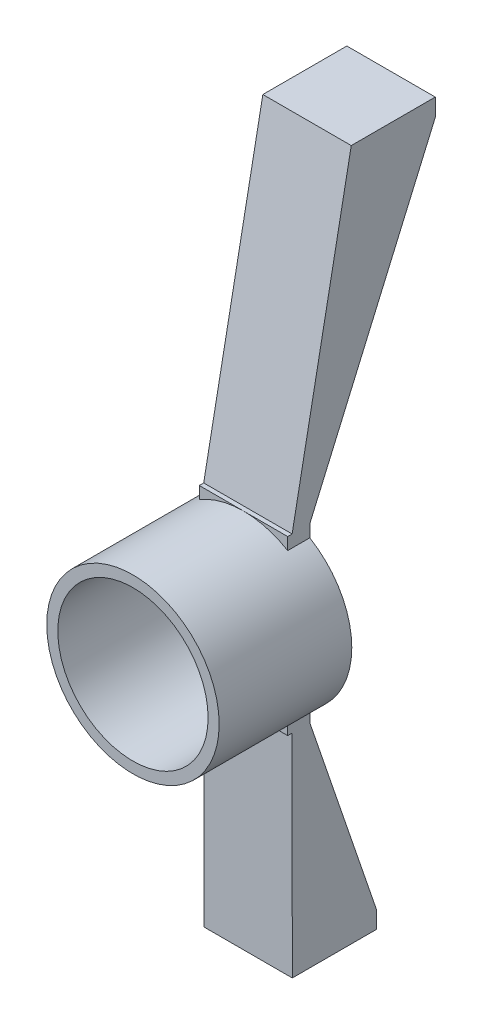
ISO-10303-21;
HEADER;
FILE_DESCRIPTION(('STEP AP214'),'2;1');
FILE_NAME('part.step','',(''),(''),'','','');
FILE_SCHEMA(('AUTOMOTIVE_DESIGN { 1 0 10303 214 1 1 1 1 }'));
ENDSEC;
DATA;
#1=APPLICATION_CONTEXT('core data for automotive mechanical design processes');
#2=APPLICATION_PROTOCOL_DEFINITION('international standard','automotive_design',2000,#1);
#3=PRODUCT_CONTEXT('',#1,'mechanical');
#4=PRODUCT('Part','Part','',(#3));
#5=PRODUCT_RELATED_PRODUCT_CATEGORY('part','',(#4));
#6=PRODUCT_DEFINITION_FORMATION('','',#4);
#7=PRODUCT_DEFINITION_CONTEXT('part definition',#1,'design');
#8=PRODUCT_DEFINITION('design','',#6,#7);
#9=PRODUCT_DEFINITION_SHAPE('','',#8);
#10=(LENGTH_UNIT() NAMED_UNIT(*) SI_UNIT(.MILLI.,.METRE.));
#11=(NAMED_UNIT(*) PLANE_ANGLE_UNIT() SI_UNIT($,.RADIAN.));
#12=(NAMED_UNIT(*) SI_UNIT($,.STERADIAN.) SOLID_ANGLE_UNIT());
#13=UNCERTAINTY_MEASURE_WITH_UNIT(LENGTH_MEASURE(1.E-05),#10,'distance_accuracy_value','');
#14=(GEOMETRIC_REPRESENTATION_CONTEXT(3) GLOBAL_UNCERTAINTY_ASSIGNED_CONTEXT((#13)) GLOBAL_UNIT_ASSIGNED_CONTEXT((#10,
#11,#12)) REPRESENTATION_CONTEXT('',''));
#15=CARTESIAN_POINT('',(0.,0.,0.));
#16=DIRECTION('',(0.,0.,1.));
#17=DIRECTION('',(1.,0.,0.));
#18=AXIS2_PLACEMENT_3D('',#15,#16,#17);
#19=CARTESIAN_POINT('',(20.,-127.,-0.0921534181914807));
#20=DIRECTION('',(0.,-1.,0.));
#21=DIRECTION('',(0.,0.,-1.));
#22=AXIS2_PLACEMENT_3D('',#19,#20,#21);
#23=PLANE('',#22);
#24=DIRECTION('',(0.,0.,1.));
#25=VECTOR('',#24,1.);
#26=CARTESIAN_POINT('',(-12.,-127.,-30.0921534181915));
#27=LINE('',#26,#25);
#28=CARTESIAN_POINT('',(-12.,-127.,-30.0921534181915));
#29=VERTEX_POINT('',#28);
#30=CARTESIAN_POINT('',(-12.,-127.,-0.0921534181914807));
#31=VERTEX_POINT('',#30);
#32=EDGE_CURVE('E96',#29,#31,#27,.T.);
#33=ORIENTED_EDGE('',*,*,#32,.T.);
#34=DIRECTION('',(-1.,0.,0.));
#35=VECTOR('',#34,1.);
#36=CARTESIAN_POINT('',(20.,-127.,-0.0921534181914807));
#37=LINE('',#36,#35);
#38=CARTESIAN_POINT('',(12.,-127.,-0.0921534181914807));
#39=VERTEX_POINT('',#38);
#40=EDGE_CURVE('E329',#39,#31,#37,.T.);
#41=ORIENTED_EDGE('',*,*,#40,.F.);
#42=DIRECTION('',(0.,0.,-1.));
#43=VECTOR('',#42,1.);
#44=CARTESIAN_POINT('',(12.,-127.,-30.0921534181915));
#45=LINE('',#44,#43);
#46=CARTESIAN_POINT('',(12.,-127.,-30.0921534181915));
#47=VERTEX_POINT('',#46);
#48=EDGE_CURVE('E265',#39,#47,#45,.T.);
#49=ORIENTED_EDGE('',*,*,#48,.T.);
#50=DIRECTION('',(-1.,0.,0.));
#51=VECTOR('',#50,1.);
#52=CARTESIAN_POINT('',(20.,-127.,-30.0921534181915));
#53=LINE('',#52,#51);
#54=EDGE_CURVE('E335',#47,#29,#53,.T.);
#55=ORIENTED_EDGE('',*,*,#54,.T.);
#56=EDGE_LOOP('',(#33,#41,#49,#55));
#57=FACE_BOUND('',#56,.T.);
#58=ADVANCED_FACE('F74',(#57),#23,.F.);
#59=CARTESIAN_POINT('',(20.,-39.,0.));
#60=DIRECTION('',(0.,-0.00104719735980363,0.999999451688695));
#61=DIRECTION('',(0.,-0.999999451688695,-0.00104719735980363));
#62=AXIS2_PLACEMENT_3D('',#59,#60,#61);
#63=PLANE('',#62);
#64=DIRECTION('',(0.,0.999999451688695,0.00104719735980363));
#65=VECTOR('',#64,1.);
#66=CARTESIAN_POINT('',(-12.,-127.,-0.0921534181914807));
#67=LINE('',#66,#65);
#68=CARTESIAN_POINT('',(-12.,-39.,0.));
#69=VERTEX_POINT('',#68);
#70=EDGE_CURVE('E261',#31,#69,#67,.T.);
#71=ORIENTED_EDGE('',*,*,#70,.T.);
#72=DIRECTION('',(1.,0.,0.));
#73=VECTOR('',#72,1.);
#74=CARTESIAN_POINT('',(0.,-39.,0.));
#75=LINE('',#74,#73);
#76=CARTESIAN_POINT('',(12.,-39.,0.));
#77=VERTEX_POINT('',#76);
#78=EDGE_CURVE('E239',#69,#77,#75,.T.);
#79=ORIENTED_EDGE('',*,*,#78,.T.);
#80=DIRECTION('',(0.,-0.999999451688695,-0.00104719735980363));
#81=VECTOR('',#80,1.);
#82=CARTESIAN_POINT('',(12.,-127.,-0.0921534181914807));
#83=LINE('',#82,#81);
#84=EDGE_CURVE('E271',#77,#39,#83,.T.);
#85=ORIENTED_EDGE('',*,*,#84,.T.);
#86=ORIENTED_EDGE('',*,*,#40,.T.);
#87=EDGE_LOOP('',(#71,#79,#85,#86));
#88=FACE_BOUND('',#87,.T.);
#89=ADVANCED_FACE('F447',(#88),#63,.F.);
#90=CARTESIAN_POINT('',(0.,0.,60.));
#91=DIRECTION('',(0.,0.,-1.));
#92=DIRECTION('',(-1.,0.,0.));
#93=AXIS2_PLACEMENT_3D('',#90,#91,#92);
#94=CYLINDRICAL_SURFACE('',#93,39.);
#95=CARTESIAN_POINT('',(0.,0.,60.));
#96=DIRECTION('',(0.,0.,1.));
#97=DIRECTION('',(1.,0.,0.));
#98=AXIS2_PLACEMENT_3D('',#95,#96,#97);
#99=CIRCLE('',#98,39.);
#100=CARTESIAN_POINT('',(39.,0.,60.));
#101=VERTEX_POINT('',#100);
#102=EDGE_CURVE('E12',#101,#101,#99,.T.);
#103=ORIENTED_EDGE('',*,*,#102,.F.);
#104=EDGE_LOOP('',(#103));
#105=FACE_BOUND('',#104,.T.);
#106=DIRECTION('',(0.,0.,-1.));
#107=VECTOR('',#106,1.);
#108=CARTESIAN_POINT('',(20.,-33.4813380855664,10.));
#109=LINE('',#108,#107);
#110=CARTESIAN_POINT('',(20.,-33.4813380855664,10.));
#111=VERTEX_POINT('',#110);
#112=CARTESIAN_POINT('',(20.,-33.4813380855664,0.));
#113=VERTEX_POINT('',#112);
#114=EDGE_CURVE('E306',#111,#113,#109,.T.);
#115=ORIENTED_EDGE('',*,*,#114,.T.);
#116=CARTESIAN_POINT('',(0.,0.,0.));
#117=DIRECTION('',(0.,0.,1.));
#118=DIRECTION('',(1.,0.,0.));
#119=AXIS2_PLACEMENT_3D('',#116,#117,#118);
#120=CIRCLE('',#119,39.);
#121=CARTESIAN_POINT('',(20.,33.4813380855664,0.));
#122=VERTEX_POINT('',#121);
#123=EDGE_CURVE('E427',#113,#122,#120,.T.);
#124=ORIENTED_EDGE('',*,*,#123,.T.);
#125=DIRECTION('',(0.,0.,-1.));
#126=VECTOR('',#125,1.);
#127=CARTESIAN_POINT('',(20.,33.4813380855664,10.));
#128=LINE('',#127,#126);
#129=CARTESIAN_POINT('',(20.,33.4813380855664,10.));
#130=VERTEX_POINT('',#129);
#131=EDGE_CURVE('E419',#130,#122,#128,.T.);
#132=ORIENTED_EDGE('',*,*,#131,.F.);
#133=CARTESIAN_POINT('',(0.,0.,10.));
#134=DIRECTION('',(0.,0.,-1.));
#135=DIRECTION('',(-1.,0.,0.));
#136=AXIS2_PLACEMENT_3D('',#133,#134,#135);
#137=CIRCLE('',#136,39.);
#138=CARTESIAN_POINT('',(0.,39.,10.));
#139=VERTEX_POINT('',#138);
#140=EDGE_CURVE('E411',#139,#130,#137,.T.);
#141=ORIENTED_EDGE('',*,*,#140,.F.);
#142=CARTESIAN_POINT('',(0.,0.,10.));
#143=DIRECTION('',(0.,0.,-1.));
#144=DIRECTION('',(-1.,0.,0.));
#145=AXIS2_PLACEMENT_3D('',#142,#143,#144);
#146=CIRCLE('',#145,39.);
#147=CARTESIAN_POINT('',(-20.,33.4813380855664,10.));
#148=VERTEX_POINT('',#147);
#149=EDGE_CURVE('E361',#148,#139,#146,.T.);
#150=ORIENTED_EDGE('',*,*,#149,.F.);
#151=DIRECTION('',(0.,0.,-1.));
#152=VECTOR('',#151,1.);
#153=CARTESIAN_POINT('',(-20.,33.4813380855664,10.));
#154=LINE('',#153,#152);
#155=CARTESIAN_POINT('',(-20.,33.4813380855664,0.));
#156=VERTEX_POINT('',#155);
#157=EDGE_CURVE('E367',#148,#156,#154,.T.);
#158=ORIENTED_EDGE('',*,*,#157,.T.);
#159=CARTESIAN_POINT('',(-20.,-33.4813380855664,0.));
#160=VERTEX_POINT('',#159);
#161=EDGE_CURVE('E78',#156,#160,#120,.T.);
#162=ORIENTED_EDGE('',*,*,#161,.T.);
#163=DIRECTION('',(0.,0.,-1.));
#164=VECTOR('',#163,1.);
#165=CARTESIAN_POINT('',(-20.,-33.4813380855664,10.));
#166=LINE('',#165,#164);
#167=CARTESIAN_POINT('',(-20.,-33.4813380855664,10.));
#168=VERTEX_POINT('',#167);
#169=EDGE_CURVE('E252',#168,#160,#166,.T.);
#170=ORIENTED_EDGE('',*,*,#169,.F.);
#171=CARTESIAN_POINT('',(0.,0.,10.));
#172=DIRECTION('',(0.,0.,-1.));
#173=DIRECTION('',(-1.,0.,0.));
#174=AXIS2_PLACEMENT_3D('',#171,#172,#173);
#175=CIRCLE('',#174,39.);
#176=CARTESIAN_POINT('',(0.,-39.,10.));
#177=VERTEX_POINT('',#176);
#178=EDGE_CURVE('E350',#177,#168,#175,.T.);
#179=ORIENTED_EDGE('',*,*,#178,.F.);
#180=CARTESIAN_POINT('',(0.,0.,10.));
#181=DIRECTION('',(0.,0.,-1.));
#182=DIRECTION('',(-1.,0.,0.));
#183=AXIS2_PLACEMENT_3D('',#180,#181,#182);
#184=CIRCLE('',#183,39.);
#185=EDGE_CURVE('E316',#111,#177,#184,.T.);
#186=ORIENTED_EDGE('',*,*,#185,.F.);
#187=EDGE_LOOP('',(#115,#124,#132,#141,#150,#158,#162,#170,#179,#186));
#188=FACE_BOUND('',#187,.T.);
#189=ADVANCED_FACE('F76',(#105,#188),#94,.T.);
#190=CARTESIAN_POINT('',(0.,-39.,10.));
#191=DIRECTION('',(0.,1.,0.));
#192=DIRECTION('',(0.,0.,1.));
#193=AXIS2_PLACEMENT_3D('',#190,#191,#192);
#194=PLANE('',#193);
#195=DIRECTION('',(0.,0.,-1.));
#196=VECTOR('',#195,1.);
#197=CARTESIAN_POINT('',(-20.,-39.,10.));
#198=LINE('',#197,#196);
#199=CARTESIAN_POINT('',(-20.,-39.,10.));
#200=VERTEX_POINT('',#199);
#201=CARTESIAN_POINT('',(-20.,-39.,8.));
#202=VERTEX_POINT('',#201);
#203=EDGE_CURVE('E352',#200,#202,#198,.T.);
#204=ORIENTED_EDGE('',*,*,#203,.T.);
#205=DIRECTION('',(-1.,0.,0.));
#206=VECTOR('',#205,1.);
#207=CARTESIAN_POINT('',(20.,-39.,8.));
#208=LINE('',#207,#206);
#209=CARTESIAN_POINT('',(20.,-39.,8.));
#210=VERTEX_POINT('',#209);
#211=EDGE_CURVE('E344',#210,#202,#208,.T.);
#212=ORIENTED_EDGE('',*,*,#211,.F.);
#213=DIRECTION('',(0.,0.,-1.));
#214=VECTOR('',#213,1.);
#215=CARTESIAN_POINT('',(20.,-39.,10.));
#216=LINE('',#215,#214);
#217=CARTESIAN_POINT('',(20.,-39.,10.));
#218=VERTEX_POINT('',#217);
#219=EDGE_CURVE('E303',#218,#210,#216,.T.);
#220=ORIENTED_EDGE('',*,*,#219,.F.);
#221=DIRECTION('',(1.,0.,0.));
#222=VECTOR('',#221,1.);
#223=CARTESIAN_POINT('',(0.,-39.,10.));
#224=LINE('',#223,#222);
#225=EDGE_CURVE('E314',#177,#218,#224,.T.);
#226=ORIENTED_EDGE('',*,*,#225,.F.);
#227=DIRECTION('',(1.,0.,0.));
#228=VECTOR('',#227,1.);
#229=CARTESIAN_POINT('',(0.,-39.,10.));
#230=LINE('',#229,#228);
#231=EDGE_CURVE('E253',#200,#177,#230,.T.);
#232=ORIENTED_EDGE('',*,*,#231,.F.);
#233=EDGE_LOOP('',(#204,#212,#220,#226,#232));
#234=FACE_BOUND('',#233,.T.);
#235=ADVANCED_FACE('F475',(#234),#194,.F.);
#236=CARTESIAN_POINT('',(0.,39.,10.));
#237=DIRECTION('',(0.,-1.,0.));
#238=DIRECTION('',(0.,0.,-1.));
#239=AXIS2_PLACEMENT_3D('',#236,#237,#238);
#240=PLANE('',#239);
#241=DIRECTION('',(-1.,0.,0.));
#242=VECTOR('',#241,1.);
#243=CARTESIAN_POINT('',(20.,39.,8.));
#244=LINE('',#243,#242);
#245=CARTESIAN_POINT('',(20.,39.,8.));
#246=VERTEX_POINT('',#245);
#247=CARTESIAN_POINT('',(-20.,39.,8.));
#248=VERTEX_POINT('',#247);
#249=EDGE_CURVE('E383',#246,#248,#244,.T.);
#250=ORIENTED_EDGE('',*,*,#249,.T.);
#251=DIRECTION('',(0.,0.,-1.));
#252=VECTOR('',#251,1.);
#253=CARTESIAN_POINT('',(-20.,39.,10.));
#254=LINE('',#253,#252);
#255=CARTESIAN_POINT('',(-20.,39.,10.));
#256=VERTEX_POINT('',#255);
#257=EDGE_CURVE('E370',#256,#248,#254,.T.);
#258=ORIENTED_EDGE('',*,*,#257,.F.);
#259=DIRECTION('',(-1.,0.,0.));
#260=VECTOR('',#259,1.);
#261=CARTESIAN_POINT('',(0.,39.,10.));
#262=LINE('',#261,#260);
#263=EDGE_CURVE('E358',#139,#256,#262,.T.);
#264=ORIENTED_EDGE('',*,*,#263,.F.);
#265=DIRECTION('',(-1.,0.,0.));
#266=VECTOR('',#265,1.);
#267=CARTESIAN_POINT('',(0.,39.,10.));
#268=LINE('',#267,#266);
#269=CARTESIAN_POINT('',(20.,39.,10.));
#270=VERTEX_POINT('',#269);
#271=EDGE_CURVE('E404',#270,#139,#268,.T.);
#272=ORIENTED_EDGE('',*,*,#271,.F.);
#273=DIRECTION('',(0.,0.,-1.));
#274=VECTOR('',#273,1.);
#275=CARTESIAN_POINT('',(20.,39.,10.));
#276=LINE('',#275,#274);
#277=EDGE_CURVE('E414',#270,#246,#276,.T.);
#278=ORIENTED_EDGE('',*,*,#277,.T.);
#279=EDGE_LOOP('',(#250,#258,#264,#272,#278));
#280=FACE_BOUND('',#279,.T.);
#281=ADVANCED_FACE('F478',(#280),#240,.F.);
#282=CARTESIAN_POINT('',(0.,0.,60.));
#283=DIRECTION('',(0.,0.,1.));
#284=DIRECTION('',(1.,0.,0.));
#285=AXIS2_PLACEMENT_3D('',#282,#283,#284);
#286=PLANE('',#285);
#287=ORIENTED_EDGE('',*,*,#102,.T.);
#288=EDGE_LOOP('',(#287));
#289=FACE_BOUND('',#288,.T.);
#290=CARTESIAN_POINT('',(0.,0.,60.));
#291=DIRECTION('',(0.,0.,1.));
#292=DIRECTION('',(1.,0.,0.));
#293=AXIS2_PLACEMENT_3D('',#290,#291,#292);
#294=CIRCLE('',#293,34.);
#295=CARTESIAN_POINT('',(34.,0.,60.));
#296=VERTEX_POINT('',#295);
#297=EDGE_CURVE('E424',#296,#296,#294,.T.);
#298=ORIENTED_EDGE('',*,*,#297,.F.);
#299=EDGE_LOOP('',(#298));
#300=FACE_BOUND('',#299,.T.);
#301=ADVANCED_FACE('F443',(#289,#300),#286,.T.);
#302=CARTESIAN_POINT('',(0.,0.,0.));
#303=DIRECTION('',(0.,0.,1.));
#304=DIRECTION('',(1.,0.,0.));
#305=AXIS2_PLACEMENT_3D('',#302,#303,#304);
#306=PLANE('',#305);
#307=ORIENTED_EDGE('',*,*,#161,.F.);
#308=DIRECTION('',(0.,-1.,0.));
#309=VECTOR('',#308,1.);
#310=CARTESIAN_POINT('',(-20.,0.,0.));
#311=LINE('',#310,#309);
#312=CARTESIAN_POINT('',(-20.,39.,0.));
#313=VERTEX_POINT('',#312);
#314=EDGE_CURVE('E355',#313,#156,#311,.T.);
#315=ORIENTED_EDGE('',*,*,#314,.F.);
#316=DIRECTION('',(-1.,0.,0.));
#317=VECTOR('',#316,1.);
#318=CARTESIAN_POINT('',(-12.,39.,0.));
#319=LINE('',#318,#317);
#320=CARTESIAN_POINT('',(-12.,39.,0.));
#321=VERTEX_POINT('',#320);
#322=EDGE_CURVE('E286',#321,#313,#319,.T.);
#323=ORIENTED_EDGE('',*,*,#322,.F.);
#324=DIRECTION('',(-1.,0.,0.));
#325=VECTOR('',#324,1.);
#326=CARTESIAN_POINT('',(0.,39.,0.));
#327=LINE('',#326,#325);
#328=CARTESIAN_POINT('',(12.,39.,0.));
#329=VERTEX_POINT('',#328);
#330=EDGE_CURVE('E403',#329,#321,#327,.T.);
#331=ORIENTED_EDGE('',*,*,#330,.F.);
#332=CARTESIAN_POINT('',(20.,39.,0.));
#333=VERTEX_POINT('',#332);
#334=EDGE_CURVE('E415',#333,#329,#327,.T.);
#335=ORIENTED_EDGE('',*,*,#334,.F.);
#336=DIRECTION('',(0.,-1.,0.));
#337=VECTOR('',#336,1.);
#338=CARTESIAN_POINT('',(20.,0.,0.));
#339=LINE('',#338,#337);
#340=EDGE_CURVE('E408',#333,#122,#339,.T.);
#341=ORIENTED_EDGE('',*,*,#340,.T.);
#342=ORIENTED_EDGE('',*,*,#123,.F.);
#343=DIRECTION('',(0.,1.,0.));
#344=VECTOR('',#343,1.);
#345=CARTESIAN_POINT('',(20.,0.,0.));
#346=LINE('',#345,#344);
#347=CARTESIAN_POINT('',(20.,-39.,0.));
#348=VERTEX_POINT('',#347);
#349=EDGE_CURVE('E311',#348,#113,#346,.T.);
#350=ORIENTED_EDGE('',*,*,#349,.F.);
#351=DIRECTION('',(1.,0.,0.));
#352=VECTOR('',#351,1.);
#353=CARTESIAN_POINT('',(12.,-39.,0.));
#354=LINE('',#353,#352);
#355=EDGE_CURVE('E274',#77,#348,#354,.T.);
#356=ORIENTED_EDGE('',*,*,#355,.F.);
#357=ORIENTED_EDGE('',*,*,#78,.F.);
#358=CARTESIAN_POINT('',(-20.,-39.,0.));
#359=VERTEX_POINT('',#358);
#360=EDGE_CURVE('E232',#359,#69,#75,.T.);
#361=ORIENTED_EDGE('',*,*,#360,.F.);
#362=DIRECTION('',(0.,1.,0.));
#363=VECTOR('',#362,1.);
#364=CARTESIAN_POINT('',(-20.,0.,0.));
#365=LINE('',#364,#363);
#366=EDGE_CURVE('E237',#359,#160,#365,.T.);
#367=ORIENTED_EDGE('',*,*,#366,.T.);
#368=EDGE_LOOP('',(#307,#315,#323,#331,#335,#341,#342,#350,#356,#357,#361,#367));
#369=FACE_BOUND('',#368,.T.);
#370=CARTESIAN_POINT('',(0.,0.,0.));
#371=DIRECTION('',(0.,0.,1.));
#372=DIRECTION('',(1.,0.,0.));
#373=AXIS2_PLACEMENT_3D('',#370,#371,#372);
#374=CIRCLE('',#373,34.);
#375=CARTESIAN_POINT('',(34.,0.,0.));
#376=VERTEX_POINT('',#375);
#377=EDGE_CURVE('E422',#376,#376,#374,.T.);
#378=ORIENTED_EDGE('',*,*,#377,.T.);
#379=EDGE_LOOP('',(#378));
#380=FACE_BOUND('',#379,.T.);
#381=ADVANCED_FACE('F235',(#369,#380),#306,.F.);
#382=CARTESIAN_POINT('',(0.,0.,60.));
#383=DIRECTION('',(0.,0.,-1.));
#384=DIRECTION('',(-1.,0.,0.));
#385=AXIS2_PLACEMENT_3D('',#382,#383,#384);
#386=CYLINDRICAL_SURFACE('',#385,34.);
#387=ORIENTED_EDGE('',*,*,#297,.T.);
#388=EDGE_LOOP('',(#387));
#389=FACE_BOUND('',#388,.T.);
#390=ORIENTED_EDGE('',*,*,#377,.F.);
#391=EDGE_LOOP('',(#390));
#392=FACE_BOUND('',#391,.T.);
#393=ADVANCED_FACE('F431',(#389,#392),#386,.F.);
#394=CARTESIAN_POINT('',(20.,0.,10.));
#395=DIRECTION('',(1.,0.,0.));
#396=DIRECTION('',(0.,0.,-1.));
#397=AXIS2_PLACEMENT_3D('',#394,#395,#396);
#398=PLANE('',#397);
#399=ORIENTED_EDGE('',*,*,#340,.F.);
#400=DIRECTION('',(0.,0.917366710580717,-0.398043111130333));
#401=VECTOR('',#400,1.);
#402=CARTESIAN_POINT('',(20.,169.8,-56.7537914068078));
#403=LINE('',#402,#401);
#404=CARTESIAN_POINT('',(20.,169.8,-56.7537914068078));
#405=VERTEX_POINT('',#404);
#406=EDGE_CURVE('E291',#333,#405,#403,.T.);
#407=ORIENTED_EDGE('',*,*,#406,.T.);
#408=DIRECTION('',(0.,1.,0.));
#409=VECTOR('',#408,1.);
#410=CARTESIAN_POINT('',(20.,169.8,-56.7537914068078));
#411=LINE('',#410,#409);
#412=CARTESIAN_POINT('',(20.,177.8,-56.7537914068078));
#413=VERTEX_POINT('',#412);
#414=EDGE_CURVE('E375',#405,#413,#411,.T.);
#415=ORIENTED_EDGE('',*,*,#414,.T.);
#416=DIRECTION('',(0.,0.,1.));
#417=VECTOR('',#416,1.);
#418=CARTESIAN_POINT('',(20.,177.8,-18.7537914068078));
#419=LINE('',#418,#417);
#420=CARTESIAN_POINT('',(20.,177.8,-18.7537914068078));
#421=VERTEX_POINT('',#420);
#422=EDGE_CURVE('E377',#413,#421,#419,.T.);
#423=ORIENTED_EDGE('',*,*,#422,.T.);
#424=DIRECTION('',(0.,-0.981925694359719,0.189266824235482));
#425=VECTOR('',#424,1.);
#426=CARTESIAN_POINT('',(20.,39.,8.));
#427=LINE('',#426,#425);
#428=EDGE_CURVE('E380',#421,#246,#427,.T.);
#429=ORIENTED_EDGE('',*,*,#428,.T.);
#430=ORIENTED_EDGE('',*,*,#277,.F.);
#431=DIRECTION('',(0.,-1.,0.));
#432=VECTOR('',#431,1.);
#433=CARTESIAN_POINT('',(20.,0.,10.));
#434=LINE('',#433,#432);
#435=EDGE_CURVE('E407',#270,#130,#434,.T.);
#436=ORIENTED_EDGE('',*,*,#435,.T.);
#437=ORIENTED_EDGE('',*,*,#131,.T.);
#438=EDGE_LOOP('',(#399,#407,#415,#423,#429,#430,#436,#437));
#439=FACE_BOUND('',#438,.T.);
#440=ADVANCED_FACE('F433',(#439),#398,.T.);
#441=CARTESIAN_POINT('',(0.,0.,10.));
#442=DIRECTION('',(0.,0.,-1.));
#443=DIRECTION('',(-1.,0.,0.));
#444=AXIS2_PLACEMENT_3D('',#441,#442,#443);
#445=PLANE('',#444);
#446=ORIENTED_EDGE('',*,*,#271,.T.);
#447=ORIENTED_EDGE('',*,*,#140,.T.);
#448=ORIENTED_EDGE('',*,*,#435,.F.);
#449=EDGE_LOOP('',(#446,#447,#448));
#450=FACE_BOUND('',#449,.T.);
#451=ADVANCED_FACE('F440',(#450),#445,.F.);
#452=CARTESIAN_POINT('',(20.,39.,0.));
#453=DIRECTION('',(0.,0.189266824235482,0.981925694359718));
#454=DIRECTION('',(0.,-0.981925694359718,0.189266824235482));
#455=AXIS2_PLACEMENT_3D('',#452,#453,#454);
#456=PLANE('',#455);
#457=ORIENTED_EDGE('',*,*,#330,.T.);
#458=DIRECTION('',(0.,0.981925694359718,-0.189266824235482));
#459=VECTOR('',#458,1.);
#460=CARTESIAN_POINT('',(-12.,39.,0.));
#461=LINE('',#460,#459);
#462=CARTESIAN_POINT('',(-12.,169.8,-25.2117861384039));
#463=VERTEX_POINT('',#462);
#464=EDGE_CURVE('E282',#321,#463,#461,.T.);
#465=ORIENTED_EDGE('',*,*,#464,.T.);
#466=DIRECTION('',(-1.,0.,0.));
#467=VECTOR('',#466,1.);
#468=CARTESIAN_POINT('',(20.,169.8,-25.2117861384039));
#469=LINE('',#468,#467);
#470=CARTESIAN_POINT('',(12.,169.8,-25.2117861384039));
#471=VERTEX_POINT('',#470);
#472=EDGE_CURVE('E400',#471,#463,#469,.T.);
#473=ORIENTED_EDGE('',*,*,#472,.F.);
#474=DIRECTION('',(0.,-0.981925694359718,0.189266824235482));
#475=VECTOR('',#474,1.);
#476=CARTESIAN_POINT('',(12.,39.,0.));
#477=LINE('',#476,#475);
#478=EDGE_CURVE('E294',#471,#329,#477,.T.);
#479=ORIENTED_EDGE('',*,*,#478,.T.);
#480=EDGE_LOOP('',(#457,#465,#473,#479));
#481=FACE_BOUND('',#480,.T.);
#482=ADVANCED_FACE('F502',(#481),#456,.F.);
#483=CARTESIAN_POINT('',(20.,169.8,-25.2117861384039));
#484=DIRECTION('',(0.,1.,0.));
#485=DIRECTION('',(0.,0.,1.));
#486=AXIS2_PLACEMENT_3D('',#483,#484,#485);
#487=PLANE('',#486);
#488=ORIENTED_EDGE('',*,*,#472,.T.);
#489=DIRECTION('',(0.,0.,-1.));
#490=VECTOR('',#489,1.);
#491=CARTESIAN_POINT('',(-12.,169.8,-25.2117861384039));
#492=LINE('',#491,#490);
#493=CARTESIAN_POINT('',(-12.,169.8,-56.7537914068078));
#494=VERTEX_POINT('',#493);
#495=EDGE_CURVE('E284',#463,#494,#492,.T.);
#496=ORIENTED_EDGE('',*,*,#495,.T.);
#497=DIRECTION('',(-1.,0.,0.));
#498=VECTOR('',#497,1.);
#499=CARTESIAN_POINT('',(20.,169.8,-56.7537914068078));
#500=LINE('',#499,#498);
#501=CARTESIAN_POINT('',(12.,169.8,-56.7537914068078));
#502=VERTEX_POINT('',#501);
#503=EDGE_CURVE('E396',#502,#494,#500,.T.);
#504=ORIENTED_EDGE('',*,*,#503,.F.);
#505=DIRECTION('',(0.,0.,1.));
#506=VECTOR('',#505,1.);
#507=CARTESIAN_POINT('',(12.,169.8,-25.2117861384039));
#508=LINE('',#507,#506);
#509=EDGE_CURVE('E300',#502,#471,#508,.T.);
#510=ORIENTED_EDGE('',*,*,#509,.T.);
#511=EDGE_LOOP('',(#488,#496,#504,#510));
#512=FACE_BOUND('',#511,.T.);
#513=ADVANCED_FACE('F498',(#512),#487,.F.);
#514=CARTESIAN_POINT('',(20.,169.8,-56.7537914068078));
#515=DIRECTION('',(0.,0.,1.));
#516=DIRECTION('',(1.,0.,0.));
#517=AXIS2_PLACEMENT_3D('',#514,#515,#516);
#518=PLANE('',#517);
#519=DIRECTION('',(0.,1.,0.));
#520=VECTOR('',#519,1.);
#521=CARTESIAN_POINT('',(-20.,169.8,-56.7537914068078));
#522=LINE('',#521,#520);
#523=CARTESIAN_POINT('',(-20.,169.8,-56.7537914068078));
#524=VERTEX_POINT('',#523);
#525=CARTESIAN_POINT('',(-20.,177.8,-56.7537914068078));
#526=VERTEX_POINT('',#525);
#527=EDGE_CURVE('E373',#524,#526,#522,.T.);
#528=ORIENTED_EDGE('',*,*,#527,.T.);
#529=DIRECTION('',(-1.,0.,0.));
#530=VECTOR('',#529,1.);
#531=CARTESIAN_POINT('',(20.,177.8,-56.7537914068078));
#532=LINE('',#531,#530);
#533=EDGE_CURVE('E393',#413,#526,#532,.T.);
#534=ORIENTED_EDGE('',*,*,#533,.F.);
#535=ORIENTED_EDGE('',*,*,#414,.F.);
#536=EDGE_CURVE('E397',#405,#502,#500,.T.);
#537=ORIENTED_EDGE('',*,*,#536,.T.);
#538=ORIENTED_EDGE('',*,*,#503,.T.);
#539=DIRECTION('',(-1.,0.,0.));
#540=VECTOR('',#539,1.);
#541=CARTESIAN_POINT('',(-12.,169.8,-56.7537914068078));
#542=LINE('',#541,#540);
#543=EDGE_CURVE('E289',#494,#524,#542,.T.);
#544=ORIENTED_EDGE('',*,*,#543,.T.);
#545=EDGE_LOOP('',(#528,#534,#535,#537,#538,#544));
#546=FACE_BOUND('',#545,.T.);
#547=ADVANCED_FACE('F494',(#546),#518,.F.);
#548=CARTESIAN_POINT('',(20.,177.8,-18.7537914068078));
#549=DIRECTION('',(0.,-1.,0.));
#550=DIRECTION('',(0.,0.,-1.));
#551=AXIS2_PLACEMENT_3D('',#548,#549,#550);
#552=PLANE('',#551);
#553=DIRECTION('',(0.,0.,1.));
#554=VECTOR('',#553,1.);
#555=CARTESIAN_POINT('',(-20.,177.8,-18.7537914068078));
#556=LINE('',#555,#554);
#557=CARTESIAN_POINT('',(-20.,177.8,-18.7537914068078));
#558=VERTEX_POINT('',#557);
#559=EDGE_CURVE('E385',#526,#558,#556,.T.);
#560=ORIENTED_EDGE('',*,*,#559,.T.);
#561=DIRECTION('',(-1.,0.,0.));
#562=VECTOR('',#561,1.);
#563=CARTESIAN_POINT('',(20.,177.8,-18.7537914068078));
#564=LINE('',#563,#562);
#565=EDGE_CURVE('E390',#421,#558,#564,.T.);
#566=ORIENTED_EDGE('',*,*,#565,.F.);
#567=ORIENTED_EDGE('',*,*,#422,.F.);
#568=ORIENTED_EDGE('',*,*,#533,.T.);
#569=EDGE_LOOP('',(#560,#566,#567,#568));
#570=FACE_BOUND('',#569,.T.);
#571=ADVANCED_FACE('F490',(#570),#552,.F.);
#572=CARTESIAN_POINT('',(20.,39.,8.));
#573=DIRECTION('',(0.,-0.189266824235482,-0.981925694359719));
#574=DIRECTION('',(0.,0.981925694359719,-0.189266824235482));
#575=AXIS2_PLACEMENT_3D('',#572,#573,#574);
#576=PLANE('',#575);
#577=DIRECTION('',(0.,-0.981925694359719,0.189266824235482));
#578=VECTOR('',#577,1.);
#579=CARTESIAN_POINT('',(-20.,39.,8.));
#580=LINE('',#579,#578);
#581=EDGE_CURVE('E378',#558,#248,#580,.T.);
#582=ORIENTED_EDGE('',*,*,#581,.T.);
#583=ORIENTED_EDGE('',*,*,#249,.F.);
#584=ORIENTED_EDGE('',*,*,#428,.F.);
#585=ORIENTED_EDGE('',*,*,#565,.T.);
#586=EDGE_LOOP('',(#582,#583,#584,#585));
#587=FACE_BOUND('',#586,.T.);
#588=ADVANCED_FACE('F486',(#587),#576,.F.);
#589=CARTESIAN_POINT('',(-20.,0.,0.));
#590=DIRECTION('',(-1.,0.,0.));
#591=DIRECTION('',(0.,0.,1.));
#592=AXIS2_PLACEMENT_3D('',#589,#590,#591);
#593=PLANE('',#592);
#594=ORIENTED_EDGE('',*,*,#527,.F.);
#595=DIRECTION('',(0.,-0.917366710580717,0.398043111130333));
#596=VECTOR('',#595,1.);
#597=CARTESIAN_POINT('',(-20.,169.8,-56.7537914068078));
#598=LINE('',#597,#596);
#599=EDGE_CURVE('E278',#524,#313,#598,.T.);
#600=ORIENTED_EDGE('',*,*,#599,.T.);
#601=ORIENTED_EDGE('',*,*,#314,.T.);
#602=ORIENTED_EDGE('',*,*,#157,.F.);
#603=DIRECTION('',(0.,-1.,0.));
#604=VECTOR('',#603,1.);
#605=CARTESIAN_POINT('',(-20.,0.,10.));
#606=LINE('',#605,#604);
#607=EDGE_CURVE('E364',#256,#148,#606,.T.);
#608=ORIENTED_EDGE('',*,*,#607,.F.);
#609=ORIENTED_EDGE('',*,*,#257,.T.);
#610=ORIENTED_EDGE('',*,*,#581,.F.);
#611=ORIENTED_EDGE('',*,*,#559,.F.);
#612=EDGE_LOOP('',(#594,#600,#601,#602,#608,#609,#610,#611));
#613=FACE_BOUND('',#612,.T.);
#614=ADVANCED_FACE('F482',(#613),#593,.T.);
#615=CARTESIAN_POINT('',(0.,0.,10.));
#616=DIRECTION('',(0.,0.,-1.));
#617=DIRECTION('',(-1.,0.,0.));
#618=AXIS2_PLACEMENT_3D('',#615,#616,#617);
#619=PLANE('',#618);
#620=ORIENTED_EDGE('',*,*,#263,.T.);
#621=ORIENTED_EDGE('',*,*,#607,.T.);
#622=ORIENTED_EDGE('',*,*,#149,.T.);
#623=EDGE_LOOP('',(#620,#621,#622));
#624=FACE_BOUND('',#623,.T.);
#625=ADVANCED_FACE('F472',(#624),#619,.F.);
#626=CARTESIAN_POINT('',(-20.,0.,10.));
#627=DIRECTION('',(-1.,0.,0.));
#628=DIRECTION('',(0.,0.,1.));
#629=AXIS2_PLACEMENT_3D('',#626,#627,#628);
#630=PLANE('',#629);
#631=ORIENTED_EDGE('',*,*,#366,.F.);
#632=DIRECTION('',(0.,-0.946207147348666,-0.323561484584152));
#633=VECTOR('',#632,1.);
#634=CARTESIAN_POINT('',(-20.,-39.,0.));
#635=LINE('',#634,#633);
#636=CARTESIAN_POINT('',(-20.,-127.,-30.0921534181915));
#637=VERTEX_POINT('',#636);
#638=EDGE_CURVE('E250',#359,#637,#635,.T.);
#639=ORIENTED_EDGE('',*,*,#638,.T.);
#640=DIRECTION('',(0.,0.999999451678283,-0.00104720730182724));
#641=VECTOR('',#640,1.);
#642=CARTESIAN_POINT('',(-20.,-127.,-30.0921534181915));
#643=LINE('',#642,#641);
#644=CARTESIAN_POINT('',(-20.,-134.999963445912,-30.0837757934629));
#645=VERTEX_POINT('',#644);
#646=EDGE_CURVE('E324',#645,#637,#643,.T.);
#647=ORIENTED_EDGE('',*,*,#646,.F.);
#648=DIRECTION('',(0.,0.,-1.));
#649=VECTOR('',#648,1.);
#650=CARTESIAN_POINT('',(-20.,-134.999963445912,7.91622420653706));
#651=LINE('',#650,#649);
#652=CARTESIAN_POINT('',(-20.,-134.999963445912,7.91622420653706));
#653=VERTEX_POINT('',#652);
#654=EDGE_CURVE('E331',#653,#645,#651,.T.);
#655=ORIENTED_EDGE('',*,*,#654,.F.);
#656=DIRECTION('',(0.,-0.99999961922825,-0.000872664515238929));
#657=VECTOR('',#656,1.);
#658=CARTESIAN_POINT('',(-20.,-39.,8.));
#659=LINE('',#658,#657);
#660=EDGE_CURVE('E313',#202,#653,#659,.T.);
#661=ORIENTED_EDGE('',*,*,#660,.F.);
#662=ORIENTED_EDGE('',*,*,#203,.F.);
#663=DIRECTION('',(0.,1.,0.));
#664=VECTOR('',#663,1.);
#665=CARTESIAN_POINT('',(-20.,0.,10.));
#666=LINE('',#665,#664);
#667=EDGE_CURVE('E348',#200,#168,#666,.T.);
#668=ORIENTED_EDGE('',*,*,#667,.T.);
#669=ORIENTED_EDGE('',*,*,#169,.T.);
#670=EDGE_LOOP('',(#631,#639,#647,#655,#661,#662,#668,#669));
#671=FACE_BOUND('',#670,.T.);
#672=ADVANCED_FACE('F248',(#671),#630,.T.);
#673=CARTESIAN_POINT('',(0.,0.,10.));
#674=DIRECTION('',(0.,0.,-1.));
#675=DIRECTION('',(-1.,0.,0.));
#676=AXIS2_PLACEMENT_3D('',#673,#674,#675);
#677=PLANE('',#676);
#678=ORIENTED_EDGE('',*,*,#231,.T.);
#679=ORIENTED_EDGE('',*,*,#178,.T.);
#680=ORIENTED_EDGE('',*,*,#667,.F.);
#681=EDGE_LOOP('',(#678,#679,#680));
#682=FACE_BOUND('',#681,.T.);
#683=ADVANCED_FACE('F467',(#682),#677,.F.);
#684=CARTESIAN_POINT('',(20.,-39.,8.));
#685=DIRECTION('',(0.,0.000872664515238929,-0.999999619228249));
#686=DIRECTION('',(0.,0.999999619228249,0.000872664515238929));
#687=AXIS2_PLACEMENT_3D('',#684,#685,#686);
#688=PLANE('',#687);
#689=ORIENTED_EDGE('',*,*,#660,.T.);
#690=DIRECTION('',(-1.,0.,0.));
#691=VECTOR('',#690,1.);
#692=CARTESIAN_POINT('',(20.,-134.999963445912,7.91622420653706));
#693=LINE('',#692,#691);
#694=CARTESIAN_POINT('',(20.,-134.999963445912,7.91622420653706));
#695=VERTEX_POINT('',#694);
#696=EDGE_CURVE('E341',#695,#653,#693,.T.);
#697=ORIENTED_EDGE('',*,*,#696,.F.);
#698=DIRECTION('',(0.,-0.99999961922825,-0.000872664515238929));
#699=VECTOR('',#698,1.);
#700=CARTESIAN_POINT('',(20.,-39.,8.));
#701=LINE('',#700,#699);
#702=EDGE_CURVE('E321',#210,#695,#701,.T.);
#703=ORIENTED_EDGE('',*,*,#702,.F.);
#704=ORIENTED_EDGE('',*,*,#211,.T.);
#705=EDGE_LOOP('',(#689,#697,#703,#704));
#706=FACE_BOUND('',#705,.T.);
#707=ADVANCED_FACE('F463',(#706),#688,.F.);
#708=CARTESIAN_POINT('',(20.,-134.999963445912,7.91622420653706));
#709=DIRECTION('',(0.,1.,0.));
#710=DIRECTION('',(0.,0.,1.));
#711=AXIS2_PLACEMENT_3D('',#708,#709,#710);
#712=PLANE('',#711);
#713=ORIENTED_EDGE('',*,*,#654,.T.);
#714=DIRECTION('',(-1.,0.,0.));
#715=VECTOR('',#714,1.);
#716=CARTESIAN_POINT('',(20.,-134.999963445912,-30.0837757934629));
#717=LINE('',#716,#715);
#718=CARTESIAN_POINT('',(20.,-134.999963445912,-30.0837757934629));
#719=VERTEX_POINT('',#718);
#720=EDGE_CURVE('E338',#719,#645,#717,.T.);
#721=ORIENTED_EDGE('',*,*,#720,.F.);
#722=DIRECTION('',(0.,0.,-1.));
#723=VECTOR('',#722,1.);
#724=CARTESIAN_POINT('',(20.,-134.999963445912,7.91622420653706));
#725=LINE('',#724,#723);
#726=EDGE_CURVE('E323',#695,#719,#725,.T.);
#727=ORIENTED_EDGE('',*,*,#726,.F.);
#728=ORIENTED_EDGE('',*,*,#696,.T.);
#729=EDGE_LOOP('',(#713,#721,#727,#728));
#730=FACE_BOUND('',#729,.T.);
#731=ADVANCED_FACE('F460',(#730),#712,.F.);
#732=CARTESIAN_POINT('',(20.,-127.,-30.0921534181915));
#733=DIRECTION('',(0.,0.00104720730182724,0.999999451678283));
#734=DIRECTION('',(0.,-0.999999451678283,0.00104720730182724));
#735=AXIS2_PLACEMENT_3D('',#732,#733,#734);
#736=PLANE('',#735);
#737=ORIENTED_EDGE('',*,*,#646,.T.);
#738=DIRECTION('',(-1.,0.,0.));
#739=VECTOR('',#738,1.);
#740=CARTESIAN_POINT('',(-12.,-127.,-30.0921534181915));
#741=LINE('',#740,#739);
#742=EDGE_CURVE('E89',#29,#637,#741,.T.);
#743=ORIENTED_EDGE('',*,*,#742,.F.);
#744=ORIENTED_EDGE('',*,*,#54,.F.);
#745=CARTESIAN_POINT('',(20.,-127.,-30.0921534181915));
#746=VERTEX_POINT('',#745);
#747=EDGE_CURVE('E336',#746,#47,#53,.T.);
#748=ORIENTED_EDGE('',*,*,#747,.F.);
#749=DIRECTION('',(0.,0.999999451678283,-0.00104720730182724));
#750=VECTOR('',#749,1.);
#751=CARTESIAN_POINT('',(20.,-127.,-30.0921534181915));
#752=LINE('',#751,#750);
#753=EDGE_CURVE('E326',#719,#746,#752,.T.);
#754=ORIENTED_EDGE('',*,*,#753,.F.);
#755=ORIENTED_EDGE('',*,*,#720,.T.);
#756=EDGE_LOOP('',(#737,#743,#744,#748,#754,#755));
#757=FACE_BOUND('',#756,.T.);
#758=ADVANCED_FACE('F456',(#757),#736,.F.);
#759=CARTESIAN_POINT('',(20.,0.,0.));
#760=DIRECTION('',(1.,0.,0.));
#761=DIRECTION('',(0.,0.,-1.));
#762=AXIS2_PLACEMENT_3D('',#759,#760,#761);
#763=PLANE('',#762);
#764=ORIENTED_EDGE('',*,*,#753,.T.);
#765=DIRECTION('',(0.,0.946207147348666,0.323561484584152));
#766=VECTOR('',#765,1.);
#767=CARTESIAN_POINT('',(20.,-39.,0.));
#768=LINE('',#767,#766);
#769=EDGE_CURVE('E264',#746,#348,#768,.T.);
#770=ORIENTED_EDGE('',*,*,#769,.T.);
#771=ORIENTED_EDGE('',*,*,#349,.T.);
#772=ORIENTED_EDGE('',*,*,#114,.F.);
#773=DIRECTION('',(0.,1.,0.));
#774=VECTOR('',#773,1.);
#775=CARTESIAN_POINT('',(20.,0.,10.));
#776=LINE('',#775,#774);
#777=EDGE_CURVE('E309',#218,#111,#776,.T.);
#778=ORIENTED_EDGE('',*,*,#777,.F.);
#779=ORIENTED_EDGE('',*,*,#219,.T.);
#780=ORIENTED_EDGE('',*,*,#702,.T.);
#781=ORIENTED_EDGE('',*,*,#726,.T.);
#782=EDGE_LOOP('',(#764,#770,#771,#772,#778,#779,#780,#781));
#783=FACE_BOUND('',#782,.T.);
#784=ADVANCED_FACE('F459',(#783),#763,.T.);
#785=CARTESIAN_POINT('',(0.,0.,10.));
#786=DIRECTION('',(0.,0.,-1.));
#787=DIRECTION('',(-1.,0.,0.));
#788=AXIS2_PLACEMENT_3D('',#785,#786,#787);
#789=PLANE('',#788);
#790=ORIENTED_EDGE('',*,*,#225,.T.);
#791=ORIENTED_EDGE('',*,*,#777,.T.);
#792=ORIENTED_EDGE('',*,*,#185,.T.);
#793=EDGE_LOOP('',(#790,#791,#792));
#794=FACE_BOUND('',#793,.T.);
#795=ADVANCED_FACE('F558',(#794),#789,.F.);
#796=CARTESIAN_POINT('',(12.,169.8,-56.7537914068078));
#797=DIRECTION('',(0.,-0.398043111130333,-0.917366710580717));
#798=DIRECTION('',(0.,0.917366710580717,-0.398043111130333));
#799=AXIS2_PLACEMENT_3D('',#796,#797,#798);
#800=PLANE('',#799);
#801=ORIENTED_EDGE('',*,*,#406,.F.);
#802=ORIENTED_EDGE('',*,*,#334,.T.);
#803=DIRECTION('',(0.,0.917366710580717,-0.398043111130333));
#804=VECTOR('',#803,1.);
#805=CARTESIAN_POINT('',(12.,169.8,-56.7537914068078));
#806=LINE('',#805,#804);
#807=EDGE_CURVE('E297',#329,#502,#806,.T.);
#808=ORIENTED_EDGE('',*,*,#807,.T.);
#809=ORIENTED_EDGE('',*,*,#536,.F.);
#810=EDGE_LOOP('',(#801,#802,#808,#809));
#811=FACE_BOUND('',#810,.T.);
#812=ADVANCED_FACE('F546',(#811),#800,.T.);
#813=CARTESIAN_POINT('',(12.,0.,0.));
#814=DIRECTION('',(-1.,0.,0.));
#815=DIRECTION('',(0.,0.,1.));
#816=AXIS2_PLACEMENT_3D('',#813,#814,#815);
#817=PLANE('',#816);
#818=ORIENTED_EDGE('',*,*,#478,.F.);
#819=ORIENTED_EDGE('',*,*,#509,.F.);
#820=ORIENTED_EDGE('',*,*,#807,.F.);
#821=EDGE_LOOP('',(#818,#819,#820));
#822=FACE_BOUND('',#821,.T.);
#823=ADVANCED_FACE('F550',(#822),#817,.T.);
#824=CARTESIAN_POINT('',(-12.,169.8,-56.7537914068078));
#825=DIRECTION('',(0.,-0.398043111130333,-0.917366710580717));
#826=DIRECTION('',(0.,0.917366710580717,-0.398043111130333));
#827=AXIS2_PLACEMENT_3D('',#824,#825,#826);
#828=PLANE('',#827);
#829=ORIENTED_EDGE('',*,*,#599,.F.);
#830=ORIENTED_EDGE('',*,*,#543,.F.);
#831=DIRECTION('',(0.,-0.917366710580717,0.398043111130333));
#832=VECTOR('',#831,1.);
#833=CARTESIAN_POINT('',(-12.,169.8,-56.7537914068078));
#834=LINE('',#833,#832);
#835=EDGE_CURVE('E279',#494,#321,#834,.T.);
#836=ORIENTED_EDGE('',*,*,#835,.T.);
#837=ORIENTED_EDGE('',*,*,#322,.T.);
#838=EDGE_LOOP('',(#829,#830,#836,#837));
#839=FACE_BOUND('',#838,.T.);
#840=ADVANCED_FACE('F533',(#839),#828,.T.);
#841=CARTESIAN_POINT('',(-12.,0.,0.));
#842=DIRECTION('',(1.,0.,0.));
#843=DIRECTION('',(0.,0.,-1.));
#844=AXIS2_PLACEMENT_3D('',#841,#842,#843);
#845=PLANE('',#844);
#846=ORIENTED_EDGE('',*,*,#835,.F.);
#847=ORIENTED_EDGE('',*,*,#495,.F.);
#848=ORIENTED_EDGE('',*,*,#464,.F.);
#849=EDGE_LOOP('',(#846,#847,#848));
#850=FACE_BOUND('',#849,.T.);
#851=ADVANCED_FACE('F542',(#850),#845,.T.);
#852=CARTESIAN_POINT('',(12.,-39.,0.));
#853=DIRECTION('',(0.,0.323561484584152,-0.946207147348666));
#854=DIRECTION('',(0.,0.946207147348666,0.323561484584152));
#855=AXIS2_PLACEMENT_3D('',#852,#853,#854);
#856=PLANE('',#855);
#857=ORIENTED_EDGE('',*,*,#769,.F.);
#858=ORIENTED_EDGE('',*,*,#747,.T.);
#859=DIRECTION('',(0.,0.946207147348666,0.323561484584152));
#860=VECTOR('',#859,1.);
#861=CARTESIAN_POINT('',(12.,-39.,0.));
#862=LINE('',#861,#860);
#863=EDGE_CURVE('E268',#47,#77,#862,.T.);
#864=ORIENTED_EDGE('',*,*,#863,.T.);
#865=ORIENTED_EDGE('',*,*,#355,.T.);
#866=EDGE_LOOP('',(#857,#858,#864,#865));
#867=FACE_BOUND('',#866,.T.);
#868=ADVANCED_FACE('F574',(#867),#856,.T.);
#869=CARTESIAN_POINT('',(12.,0.,0.));
#870=DIRECTION('',(-1.,0.,0.));
#871=DIRECTION('',(0.,0.,1.));
#872=AXIS2_PLACEMENT_3D('',#869,#870,#871);
#873=PLANE('',#872);
#874=ORIENTED_EDGE('',*,*,#48,.F.);
#875=ORIENTED_EDGE('',*,*,#84,.F.);
#876=ORIENTED_EDGE('',*,*,#863,.F.);
#877=EDGE_LOOP('',(#874,#875,#876));
#878=FACE_BOUND('',#877,.T.);
#879=ADVANCED_FACE('F577',(#878),#873,.T.);
#880=CARTESIAN_POINT('',(-12.,-39.,0.));
#881=DIRECTION('',(0.,0.323561484584152,-0.946207147348666));
#882=DIRECTION('',(0.,0.946207147348666,0.323561484584152));
#883=AXIS2_PLACEMENT_3D('',#880,#881,#882);
#884=PLANE('',#883);
#885=ORIENTED_EDGE('',*,*,#638,.F.);
#886=ORIENTED_EDGE('',*,*,#360,.T.);
#887=DIRECTION('',(0.,-0.946207147348666,-0.323561484584152));
#888=VECTOR('',#887,1.);
#889=CARTESIAN_POINT('',(-12.,-39.,0.));
#890=LINE('',#889,#888);
#891=EDGE_CURVE('E256',#69,#29,#890,.T.);
#892=ORIENTED_EDGE('',*,*,#891,.T.);
#893=ORIENTED_EDGE('',*,*,#742,.T.);
#894=EDGE_LOOP('',(#885,#886,#892,#893));
#895=FACE_BOUND('',#894,.T.);
#896=ADVANCED_FACE('F255',(#895),#884,.T.);
#897=CARTESIAN_POINT('',(-12.,0.,0.));
#898=DIRECTION('',(-1.,0.,0.));
#899=DIRECTION('',(0.,0.,1.));
#900=AXIS2_PLACEMENT_3D('',#897,#898,#899);
#901=PLANE('',#900);
#902=ORIENTED_EDGE('',*,*,#891,.F.);
#903=ORIENTED_EDGE('',*,*,#70,.F.);
#904=ORIENTED_EDGE('',*,*,#32,.F.);
#905=EDGE_LOOP('',(#902,#903,#904));
#906=FACE_BOUND('',#905,.T.);
#907=ADVANCED_FACE('F580',(#906),#901,.F.);
#908=CLOSED_SHELL('',(#58,#89,#189,#235,#281,#301,#381,#393,#440,#451,#482,#513,#547,#571,#588,
#614,#625,#672,#683,#707,#731,#758,#784,#795,#812,#823,#840,#851,#868,#879,#896,#907));
#909=MANIFOLD_SOLID_BREP('B2',#908);
#910=ADVANCED_BREP_SHAPE_REPRESENTATION('',(#18,#909),#14);
#911=SHAPE_DEFINITION_REPRESENTATION(#9,#910);
ENDSEC;
END-ISO-10303-21;
